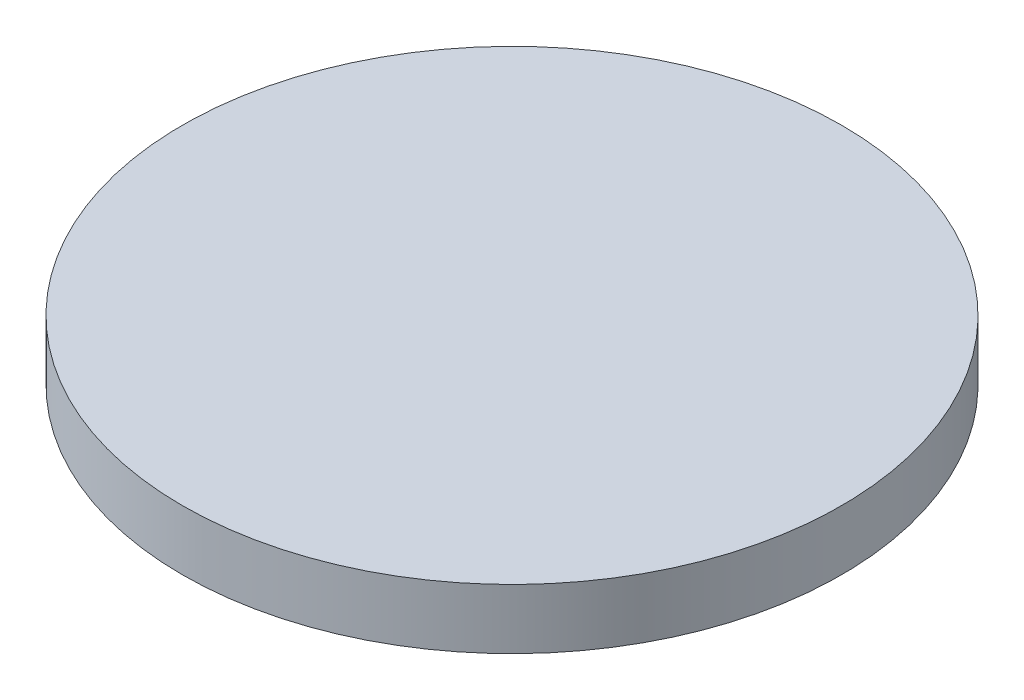
ISO-10303-21;
HEADER;
FILE_DESCRIPTION(('STEP AP214'),'2;1');
FILE_NAME('part.step','',(''),(''),'','','');
FILE_SCHEMA(('AUTOMOTIVE_DESIGN { 1 0 10303 214 1 1 1 1 }'));
ENDSEC;
DATA;
#1=APPLICATION_CONTEXT('core data for automotive mechanical design processes');
#2=APPLICATION_PROTOCOL_DEFINITION('international standard','automotive_design',2000,#1);
#3=PRODUCT_CONTEXT('',#1,'mechanical');
#4=PRODUCT('Part','Part','',(#3));
#5=PRODUCT_RELATED_PRODUCT_CATEGORY('part','',(#4));
#6=PRODUCT_DEFINITION_FORMATION('','',#4);
#7=PRODUCT_DEFINITION_CONTEXT('part definition',#1,'design');
#8=PRODUCT_DEFINITION('design','',#6,#7);
#9=PRODUCT_DEFINITION_SHAPE('','',#8);
#10=(LENGTH_UNIT() NAMED_UNIT(*) SI_UNIT(.MILLI.,.METRE.));
#11=(NAMED_UNIT(*) PLANE_ANGLE_UNIT() SI_UNIT($,.RADIAN.));
#12=(NAMED_UNIT(*) SI_UNIT($,.STERADIAN.) SOLID_ANGLE_UNIT());
#13=UNCERTAINTY_MEASURE_WITH_UNIT(LENGTH_MEASURE(1.E-05),#10,'distance_accuracy_value','');
#14=(GEOMETRIC_REPRESENTATION_CONTEXT(3) GLOBAL_UNCERTAINTY_ASSIGNED_CONTEXT((#13)) GLOBAL_UNIT_ASSIGNED_CONTEXT((#10,
#11,#12)) REPRESENTATION_CONTEXT('',''));
#15=CARTESIAN_POINT('',(0.,0.,0.));
#16=DIRECTION('',(0.,0.,1.));
#17=DIRECTION('',(1.,0.,0.));
#18=AXIS2_PLACEMENT_3D('',#15,#16,#17);
#19=CARTESIAN_POINT('',(0.,-0.5,0.));
#20=DIRECTION('',(0.,1.,0.));
#21=DIRECTION('',(0.,0.,1.));
#22=AXIS2_PLACEMENT_3D('',#19,#20,#21);
#23=CYLINDRICAL_SURFACE('',#22,2.75);
#24=CARTESIAN_POINT('',(0.,-0.5,0.));
#25=DIRECTION('',(0.,1.,0.));
#26=DIRECTION('',(0.,0.,1.));
#27=AXIS2_PLACEMENT_3D('',#24,#25,#26);
#28=CIRCLE('',#27,2.75);
#29=CARTESIAN_POINT('',(0.,-0.5,2.75));
#30=VERTEX_POINT('',#29);
#31=EDGE_CURVE('E10',#30,#30,#28,.T.);
#32=ORIENTED_EDGE('',*,*,#31,.T.);
#33=EDGE_LOOP('',(#32));
#34=FACE_BOUND('',#33,.T.);
#35=CARTESIAN_POINT('',(0.,0.,0.));
#36=DIRECTION('',(0.,1.,0.));
#37=DIRECTION('',(0.,0.,1.));
#38=AXIS2_PLACEMENT_3D('',#35,#36,#37);
#39=CIRCLE('',#38,2.75);
#40=CARTESIAN_POINT('',(0.,0.,2.75));
#41=VERTEX_POINT('',#40);
#42=EDGE_CURVE('E18',#41,#41,#39,.T.);
#43=ORIENTED_EDGE('',*,*,#42,.F.);
#44=EDGE_LOOP('',(#43));
#45=FACE_BOUND('',#44,.T.);
#46=ADVANCED_FACE('F15',(#34,#45),#23,.T.);
#47=CARTESIAN_POINT('',(0.,-0.5,0.));
#48=DIRECTION('',(0.,1.,0.));
#49=DIRECTION('',(0.,0.,1.));
#50=AXIS2_PLACEMENT_3D('',#47,#48,#49);
#51=PLANE('',#50);
#52=ORIENTED_EDGE('',*,*,#31,.F.);
#53=EDGE_LOOP('',(#52));
#54=FACE_BOUND('',#53,.T.);
#55=ADVANCED_FACE('F30',(#54),#51,.F.);
#56=CARTESIAN_POINT('',(0.,0.,0.));
#57=DIRECTION('',(0.,1.,0.));
#58=DIRECTION('',(0.,0.,1.));
#59=AXIS2_PLACEMENT_3D('',#56,#57,#58);
#60=PLANE('',#59);
#61=ORIENTED_EDGE('',*,*,#42,.T.);
#62=EDGE_LOOP('',(#61));
#63=FACE_BOUND('',#62,.T.);
#64=ADVANCED_FACE('F27',(#63),#60,.T.);
#65=CLOSED_SHELL('',(#46,#55,#64));
#66=MANIFOLD_SOLID_BREP('B1',#65);
#67=ADVANCED_BREP_SHAPE_REPRESENTATION('',(#18,#66),#14);
#68=SHAPE_DEFINITION_REPRESENTATION(#9,#67);
ENDSEC;
END-ISO-10303-21;
